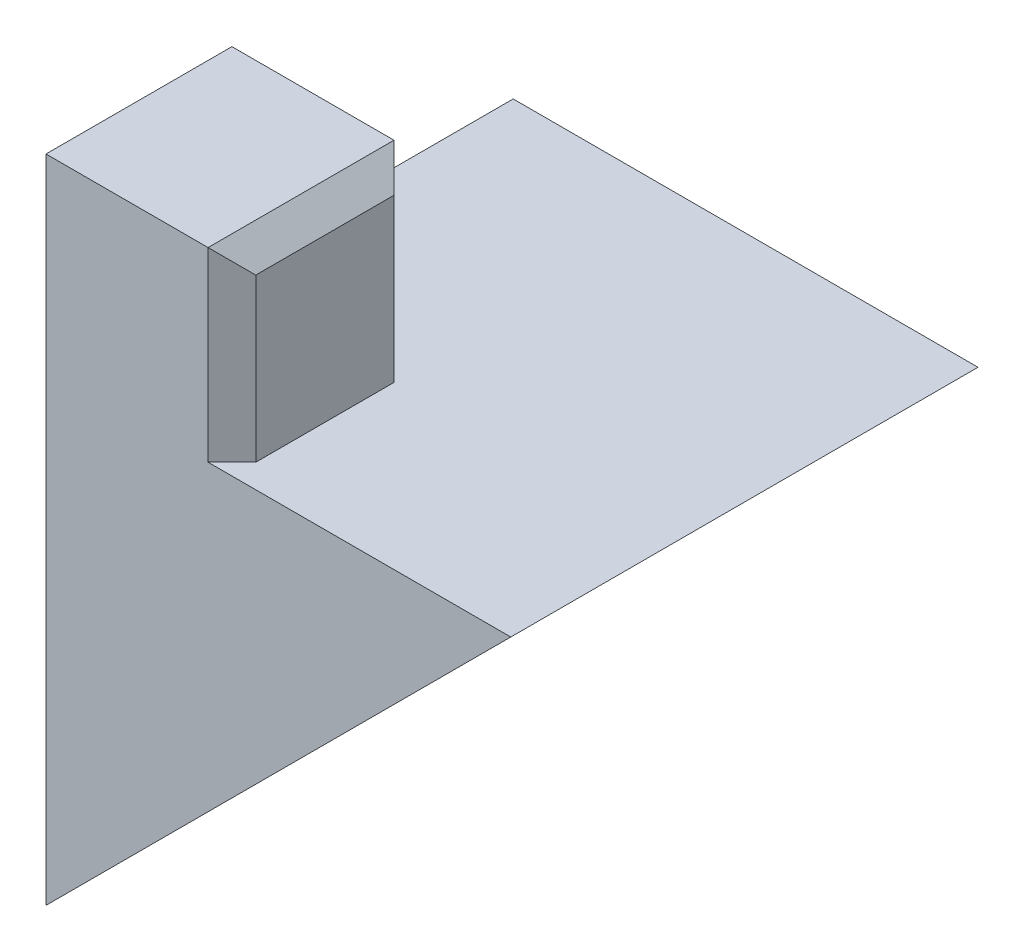
ISO-10303-21;
HEADER;
FILE_DESCRIPTION(('STEP AP214'),'2;1');
FILE_NAME('part.step','',(''),(''),'','','');
FILE_SCHEMA(('AUTOMOTIVE_DESIGN { 1 0 10303 214 1 1 1 1 }'));
ENDSEC;
DATA;
#1=APPLICATION_CONTEXT('core data for automotive mechanical design processes');
#2=APPLICATION_PROTOCOL_DEFINITION('international standard','automotive_design',2000,#1);
#3=PRODUCT_CONTEXT('',#1,'mechanical');
#4=PRODUCT('Part','Part','',(#3));
#5=PRODUCT_RELATED_PRODUCT_CATEGORY('part','',(#4));
#6=PRODUCT_DEFINITION_FORMATION('','',#4);
#7=PRODUCT_DEFINITION_CONTEXT('part definition',#1,'design');
#8=PRODUCT_DEFINITION('design','',#6,#7);
#9=PRODUCT_DEFINITION_SHAPE('','',#8);
#10=(LENGTH_UNIT() NAMED_UNIT(*) SI_UNIT(.MILLI.,.METRE.));
#11=(NAMED_UNIT(*) PLANE_ANGLE_UNIT() SI_UNIT($,.RADIAN.));
#12=(NAMED_UNIT(*) SI_UNIT($,.STERADIAN.) SOLID_ANGLE_UNIT());
#13=UNCERTAINTY_MEASURE_WITH_UNIT(LENGTH_MEASURE(1.E-05),#10,'distance_accuracy_value','');
#14=(GEOMETRIC_REPRESENTATION_CONTEXT(3) GLOBAL_UNCERTAINTY_ASSIGNED_CONTEXT((#13)) GLOBAL_UNIT_ASSIGNED_CONTEXT((#10,
#11,#12)) REPRESENTATION_CONTEXT('',''));
#15=CARTESIAN_POINT('',(0.,0.,0.));
#16=DIRECTION('',(0.,0.,1.));
#17=DIRECTION('',(1.,0.,0.));
#18=AXIS2_PLACEMENT_3D('',#15,#16,#17);
#19=CARTESIAN_POINT('',(0.,0.,-19.6));
#20=DIRECTION('',(0.,1.,0.));
#21=DIRECTION('',(0.,0.,1.));
#22=AXIS2_PLACEMENT_3D('',#19,#20,#21);
#23=PLANE('',#22);
#24=DIRECTION('',(1.,0.,0.));
#25=VECTOR('',#24,1.);
#26=CARTESIAN_POINT('',(0.,0.,-7.8));
#27=LINE('',#26,#25);
#28=CARTESIAN_POINT('',(0.,0.,-7.8));
#29=VERTEX_POINT('',#28);
#30=CARTESIAN_POINT('',(6.8,0.,-7.8));
#31=VERTEX_POINT('',#30);
#32=EDGE_CURVE('E113',#29,#31,#27,.T.);
#33=ORIENTED_EDGE('',*,*,#32,.T.);
#34=DIRECTION('',(-0.70710678118655,0.,-0.707106781186545));
#35=VECTOR('',#34,1.);
#36=CARTESIAN_POINT('',(6.8,0.,-7.8));
#37=LINE('',#36,#35);
#38=CARTESIAN_POINT('',(7.8,0.,-6.8));
#39=VERTEX_POINT('',#38);
#40=EDGE_CURVE('E11',#31,#39,#37,.F.);
#41=ORIENTED_EDGE('',*,*,#40,.T.);
#42=DIRECTION('',(0.,0.,1.));
#43=VECTOR('',#42,1.);
#44=CARTESIAN_POINT('',(7.8,0.,0.));
#45=LINE('',#44,#43);
#46=CARTESIAN_POINT('',(7.8,0.,-0.999999999999997));
#47=VERTEX_POINT('',#46);
#48=EDGE_CURVE('E132',#39,#47,#45,.T.);
#49=ORIENTED_EDGE('',*,*,#48,.T.);
#50=DIRECTION('',(-0.70710678118655,0.,0.707106781186545));
#51=VECTOR('',#50,1.);
#52=CARTESIAN_POINT('',(7.8,0.,-0.999999999999998));
#53=LINE('',#52,#51);
#54=CARTESIAN_POINT('',(6.8,0.,0.));
#55=VERTEX_POINT('',#54);
#56=EDGE_CURVE('E52',#47,#55,#53,.T.);
#57=ORIENTED_EDGE('',*,*,#56,.T.);
#58=DIRECTION('',(-1.,0.,0.));
#59=VECTOR('',#58,1.);
#60=CARTESIAN_POINT('',(0.,0.,0.));
#61=LINE('',#60,#59);
#62=CARTESIAN_POINT('',(19.5,0.,0.));
#63=VERTEX_POINT('',#62);
#64=EDGE_CURVE('E117',#63,#55,#61,.T.);
#65=ORIENTED_EDGE('',*,*,#64,.F.);
#66=DIRECTION('',(0.,0.,1.));
#67=VECTOR('',#66,1.);
#68=CARTESIAN_POINT('',(19.5,0.,-19.6));
#69=LINE('',#68,#67);
#70=CARTESIAN_POINT('',(19.5,0.,-19.6));
#71=VERTEX_POINT('',#70);
#72=EDGE_CURVE('E161',#71,#63,#69,.T.);
#73=ORIENTED_EDGE('',*,*,#72,.F.);
#74=DIRECTION('',(-1.,0.,0.));
#75=VECTOR('',#74,1.);
#76=CARTESIAN_POINT('',(0.,0.,-19.6));
#77=LINE('',#76,#75);
#78=CARTESIAN_POINT('',(0.,0.,-19.6));
#79=VERTEX_POINT('',#78);
#80=EDGE_CURVE('E140',#71,#79,#77,.T.);
#81=ORIENTED_EDGE('',*,*,#80,.T.);
#82=DIRECTION('',(0.,0.,1.));
#83=VECTOR('',#82,1.);
#84=CARTESIAN_POINT('',(0.,0.,-19.6));
#85=LINE('',#84,#83);
#86=EDGE_CURVE('E153',#79,#29,#85,.T.);
#87=ORIENTED_EDGE('',*,*,#86,.T.);
#88=EDGE_LOOP('',(#33,#41,#49,#57,#65,#73,#81,#87));
#89=FACE_BOUND('',#88,.T.);
#90=ADVANCED_FACE('F41',(#89),#23,.T.);
#91=CARTESIAN_POINT('',(19.5,0.,-19.6));
#92=DIRECTION('',(0.707106781186548,-0.707106781186547,0.));
#93=DIRECTION('',(0.707106781186547,0.707106781186548,0.));
#94=AXIS2_PLACEMENT_3D('',#91,#92,#93);
#95=PLANE('',#94);
#96=DIRECTION('',(0.707106781186547,0.707106781186548,0.));
#97=VECTOR('',#96,1.);
#98=CARTESIAN_POINT('',(19.5,0.,0.));
#99=LINE('',#98,#97);
#100=CARTESIAN_POINT('',(0.,-19.5,0.));
#101=VERTEX_POINT('',#100);
#102=EDGE_CURVE('E145',#101,#63,#99,.T.);
#103=ORIENTED_EDGE('',*,*,#102,.F.);
#104=DIRECTION('',(0.,0.,1.));
#105=VECTOR('',#104,1.);
#106=CARTESIAN_POINT('',(0.,-19.5,-19.6));
#107=LINE('',#106,#105);
#108=CARTESIAN_POINT('',(0.,-19.5,-19.6));
#109=VERTEX_POINT('',#108);
#110=EDGE_CURVE('E165',#109,#101,#107,.T.);
#111=ORIENTED_EDGE('',*,*,#110,.F.);
#112=DIRECTION('',(0.707106781186547,0.707106781186548,0.));
#113=VECTOR('',#112,1.);
#114=CARTESIAN_POINT('',(19.5,0.,-19.6));
#115=LINE('',#114,#113);
#116=EDGE_CURVE('E149',#109,#71,#115,.T.);
#117=ORIENTED_EDGE('',*,*,#116,.T.);
#118=ORIENTED_EDGE('',*,*,#72,.T.);
#119=EDGE_LOOP('',(#103,#111,#117,#118));
#120=FACE_BOUND('',#119,.T.);
#121=ADVANCED_FACE('F215',(#120),#95,.T.);
#122=CARTESIAN_POINT('',(0.,0.,-19.6));
#123=DIRECTION('',(-1.,0.,0.));
#124=DIRECTION('',(0.,-1.,0.));
#125=AXIS2_PLACEMENT_3D('',#122,#123,#124);
#126=PLANE('',#125);
#127=DIRECTION('',(0.,-1.,0.));
#128=VECTOR('',#127,1.);
#129=CARTESIAN_POINT('',(0.,0.,0.));
#130=LINE('',#129,#128);
#131=CARTESIAN_POINT('',(0.,7.8,0.));
#132=VERTEX_POINT('',#131);
#133=EDGE_CURVE('E124',#132,#101,#130,.T.);
#134=ORIENTED_EDGE('',*,*,#133,.F.);
#135=DIRECTION('',(0.,0.,1.));
#136=VECTOR('',#135,1.);
#137=CARTESIAN_POINT('',(0.,7.8,0.));
#138=LINE('',#137,#136);
#139=CARTESIAN_POINT('',(0.,7.8,-7.8));
#140=VERTEX_POINT('',#139);
#141=EDGE_CURVE('E121',#140,#132,#138,.T.);
#142=ORIENTED_EDGE('',*,*,#141,.F.);
#143=DIRECTION('',(0.,-1.,0.));
#144=VECTOR('',#143,1.);
#145=CARTESIAN_POINT('',(0.,7.8,-7.8));
#146=LINE('',#145,#144);
#147=EDGE_CURVE('E109',#140,#29,#146,.T.);
#148=ORIENTED_EDGE('',*,*,#147,.T.);
#149=ORIENTED_EDGE('',*,*,#86,.F.);
#150=DIRECTION('',(0.,-1.,0.));
#151=VECTOR('',#150,1.);
#152=CARTESIAN_POINT('',(0.,0.,-19.6));
#153=LINE('',#152,#151);
#154=EDGE_CURVE('E144',#79,#109,#153,.T.);
#155=ORIENTED_EDGE('',*,*,#154,.T.);
#156=ORIENTED_EDGE('',*,*,#110,.T.);
#157=EDGE_LOOP('',(#134,#142,#148,#149,#155,#156));
#158=FACE_BOUND('',#157,.T.);
#159=ADVANCED_FACE('F122',(#158),#126,.T.);
#160=CARTESIAN_POINT('',(0.,0.,-19.6));
#161=DIRECTION('',(0.,0.,-1.));
#162=DIRECTION('',(-1.,0.,0.));
#163=AXIS2_PLACEMENT_3D('',#160,#161,#162);
#164=PLANE('',#163);
#165=ORIENTED_EDGE('',*,*,#80,.F.);
#166=ORIENTED_EDGE('',*,*,#116,.F.);
#167=ORIENTED_EDGE('',*,*,#154,.F.);
#168=EDGE_LOOP('',(#165,#166,#167));
#169=FACE_BOUND('',#168,.T.);
#170=ADVANCED_FACE('F219',(#169),#164,.T.);
#171=CARTESIAN_POINT('',(0.,0.,0.));
#172=DIRECTION('',(0.,0.,-1.));
#173=DIRECTION('',(-1.,0.,0.));
#174=AXIS2_PLACEMENT_3D('',#171,#172,#173);
#175=PLANE('',#174);
#176=ORIENTED_EDGE('',*,*,#64,.T.);
#177=DIRECTION('',(0.,1.,0.));
#178=VECTOR('',#177,1.);
#179=CARTESIAN_POINT('',(6.8,7.8,0.));
#180=LINE('',#179,#178);
#181=CARTESIAN_POINT('',(6.8,7.8,0.));
#182=VERTEX_POINT('',#181);
#183=EDGE_CURVE('E179',#55,#182,#180,.T.);
#184=ORIENTED_EDGE('',*,*,#183,.T.);
#185=DIRECTION('',(1.,0.,0.));
#186=VECTOR('',#185,1.);
#187=CARTESIAN_POINT('',(0.,7.8,0.));
#188=LINE('',#187,#186);
#189=EDGE_CURVE('E118',#132,#182,#188,.T.);
#190=ORIENTED_EDGE('',*,*,#189,.F.);
#191=ORIENTED_EDGE('',*,*,#133,.T.);
#192=ORIENTED_EDGE('',*,*,#102,.T.);
#193=EDGE_LOOP('',(#176,#184,#190,#191,#192));
#194=FACE_BOUND('',#193,.T.);
#195=ADVANCED_FACE('F213',(#194),#175,.F.);
#196=CARTESIAN_POINT('',(7.8,7.8,0.));
#197=DIRECTION('',(1.,0.,0.));
#198=DIRECTION('',(0.,0.,-1.));
#199=AXIS2_PLACEMENT_3D('',#196,#197,#198);
#200=PLANE('',#199);
#201=DIRECTION('',(0.,0.,1.));
#202=VECTOR('',#201,1.);
#203=CARTESIAN_POINT('',(7.8,6.8,0.));
#204=LINE('',#203,#202);
#205=CARTESIAN_POINT('',(7.8,6.8,-6.8));
#206=VERTEX_POINT('',#205);
#207=CARTESIAN_POINT('',(7.8,6.8,-0.999999999999997));
#208=VERTEX_POINT('',#207);
#209=EDGE_CURVE('E164',#206,#208,#204,.T.);
#210=ORIENTED_EDGE('',*,*,#209,.T.);
#211=DIRECTION('',(0.,-1.,0.));
#212=VECTOR('',#211,1.);
#213=CARTESIAN_POINT('',(7.8,0.,-0.999999999999997));
#214=LINE('',#213,#212);
#215=EDGE_CURVE('E175',#208,#47,#214,.T.);
#216=ORIENTED_EDGE('',*,*,#215,.T.);
#217=ORIENTED_EDGE('',*,*,#48,.F.);
#218=DIRECTION('',(0.,1.,0.));
#219=VECTOR('',#218,1.);
#220=CARTESIAN_POINT('',(7.8,7.8,-6.8));
#221=LINE('',#220,#219);
#222=EDGE_CURVE('E172',#39,#206,#221,.T.);
#223=ORIENTED_EDGE('',*,*,#222,.T.);
#224=EDGE_LOOP('',(#210,#216,#217,#223));
#225=FACE_BOUND('',#224,.T.);
#226=ADVANCED_FACE('F207',(#225),#200,.T.);
#227=CARTESIAN_POINT('',(0.,7.8,-7.8));
#228=DIRECTION('',(0.,0.,-1.));
#229=DIRECTION('',(-1.,0.,0.));
#230=AXIS2_PLACEMENT_3D('',#227,#228,#229);
#231=PLANE('',#230);
#232=DIRECTION('',(1.,0.,0.));
#233=VECTOR('',#232,1.);
#234=CARTESIAN_POINT('',(0.,7.8,-7.8));
#235=LINE('',#234,#233);
#236=CARTESIAN_POINT('',(6.8,7.8,-7.8));
#237=VERTEX_POINT('',#236);
#238=EDGE_CURVE('E112',#140,#237,#235,.T.);
#239=ORIENTED_EDGE('',*,*,#238,.T.);
#240=DIRECTION('',(0.,-1.,0.));
#241=VECTOR('',#240,1.);
#242=CARTESIAN_POINT('',(6.8,7.8,-7.8));
#243=LINE('',#242,#241);
#244=EDGE_CURVE('E67',#237,#31,#243,.T.);
#245=ORIENTED_EDGE('',*,*,#244,.T.);
#246=ORIENTED_EDGE('',*,*,#32,.F.);
#247=ORIENTED_EDGE('',*,*,#147,.F.);
#248=EDGE_LOOP('',(#239,#245,#246,#247));
#249=FACE_BOUND('',#248,.T.);
#250=ADVANCED_FACE('F111',(#249),#231,.T.);
#251=CARTESIAN_POINT('',(0.,7.8,0.));
#252=DIRECTION('',(0.,1.,0.));
#253=DIRECTION('',(0.,0.,1.));
#254=AXIS2_PLACEMENT_3D('',#251,#252,#253);
#255=PLANE('',#254);
#256=ORIENTED_EDGE('',*,*,#189,.T.);
#257=DIRECTION('',(0.,0.,-1.));
#258=VECTOR('',#257,1.);
#259=CARTESIAN_POINT('',(6.8,7.8,0.));
#260=LINE('',#259,#258);
#261=EDGE_CURVE('E60',#182,#237,#260,.T.);
#262=ORIENTED_EDGE('',*,*,#261,.T.);
#263=ORIENTED_EDGE('',*,*,#238,.F.);
#264=ORIENTED_EDGE('',*,*,#141,.T.);
#265=EDGE_LOOP('',(#256,#262,#263,#264));
#266=FACE_BOUND('',#265,.T.);
#267=ADVANCED_FACE('F128',(#266),#255,.T.);
#268=CARTESIAN_POINT('',(6.8,7.8,-7.8));
#269=DIRECTION('',(-0.707106781186545,0.,0.70710678118655));
#270=DIRECTION('',(0.,-1.,0.));
#271=AXIS2_PLACEMENT_3D('',#268,#269,#270);
#272=PLANE('',#271);
#273=ORIENTED_EDGE('',*,*,#40,.F.);
#274=ORIENTED_EDGE('',*,*,#244,.F.);
#275=DIRECTION('',(-0.577350269189629,0.577350269189625,-0.577350269189625));
#276=VECTOR('',#275,1.);
#277=CARTESIAN_POINT('',(10.0666666666667,4.53333333333335,-4.53333333333335));
#278=LINE('',#277,#276);
#279=EDGE_CURVE('E46',#206,#237,#278,.T.);
#280=ORIENTED_EDGE('',*,*,#279,.F.);
#281=ORIENTED_EDGE('',*,*,#222,.F.);
#282=EDGE_LOOP('',(#273,#274,#280,#281));
#283=FACE_BOUND('',#282,.T.);
#284=ADVANCED_FACE('F44',(#283),#272,.F.);
#285=CARTESIAN_POINT('',(7.8,6.8,0.));
#286=DIRECTION('',(-0.707106781186545,-0.70710678118655,0.));
#287=DIRECTION('',(0.,0.,1.));
#288=AXIS2_PLACEMENT_3D('',#285,#286,#287);
#289=PLANE('',#288);
#290=ORIENTED_EDGE('',*,*,#279,.T.);
#291=ORIENTED_EDGE('',*,*,#261,.F.);
#292=DIRECTION('',(-0.577350269189628,0.577350269189624,0.577350269189625));
#293=VECTOR('',#292,1.);
#294=CARTESIAN_POINT('',(7.46666666666667,7.13333333333333,-0.666666666666667));
#295=LINE('',#294,#293);
#296=EDGE_CURVE('E188',#208,#182,#295,.T.);
#297=ORIENTED_EDGE('',*,*,#296,.F.);
#298=ORIENTED_EDGE('',*,*,#209,.F.);
#299=EDGE_LOOP('',(#290,#291,#297,#298));
#300=FACE_BOUND('',#299,.T.);
#301=ADVANCED_FACE('F200',(#300),#289,.F.);
#302=CARTESIAN_POINT('',(7.8,7.8,-0.999999999999998));
#303=DIRECTION('',(0.707106781186545,0.,0.70710678118655));
#304=DIRECTION('',(0.,1.,0.));
#305=AXIS2_PLACEMENT_3D('',#302,#303,#304);
#306=PLANE('',#305);
#307=ORIENTED_EDGE('',*,*,#296,.T.);
#308=ORIENTED_EDGE('',*,*,#183,.F.);
#309=ORIENTED_EDGE('',*,*,#56,.F.);
#310=ORIENTED_EDGE('',*,*,#215,.F.);
#311=EDGE_LOOP('',(#307,#308,#309,#310));
#312=FACE_BOUND('',#311,.T.);
#313=ADVANCED_FACE('F208',(#312),#306,.T.);
#314=CLOSED_SHELL('',(#90,#121,#159,#170,#195,#226,#250,#267,#284,#301,#313));
#315=MANIFOLD_SOLID_BREP('B2',#314);
#316=ADVANCED_BREP_SHAPE_REPRESENTATION('',(#18,#315),#14);
#317=SHAPE_DEFINITION_REPRESENTATION(#9,#316);
ENDSEC;
END-ISO-10303-21;
